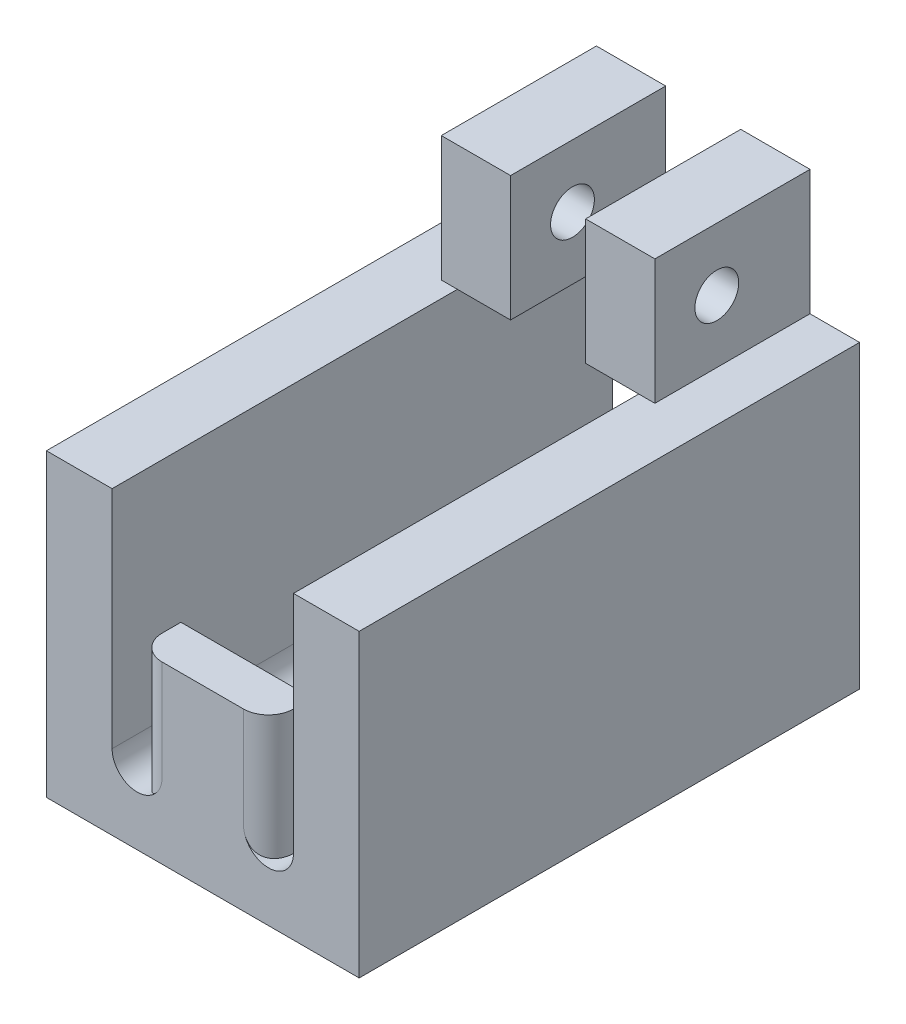
ISO-10303-21;
HEADER;
FILE_DESCRIPTION(('STEP AP214'),'2;1');
FILE_NAME('part.step','',(''),(''),'','','');
FILE_SCHEMA(('AUTOMOTIVE_DESIGN { 1 0 10303 214 1 1 1 1 }'));
ENDSEC;
DATA;
#1=APPLICATION_CONTEXT('core data for automotive mechanical design processes');
#2=APPLICATION_PROTOCOL_DEFINITION('international standard','automotive_design',2000,#1);
#3=PRODUCT_CONTEXT('',#1,'mechanical');
#4=PRODUCT('Part','Part','',(#3));
#5=PRODUCT_RELATED_PRODUCT_CATEGORY('part','',(#4));
#6=PRODUCT_DEFINITION_FORMATION('','',#4);
#7=PRODUCT_DEFINITION_CONTEXT('part definition',#1,'design');
#8=PRODUCT_DEFINITION('design','',#6,#7);
#9=PRODUCT_DEFINITION_SHAPE('','',#8);
#10=(LENGTH_UNIT() NAMED_UNIT(*) SI_UNIT(.MILLI.,.METRE.));
#11=(NAMED_UNIT(*) PLANE_ANGLE_UNIT() SI_UNIT($,.RADIAN.));
#12=(NAMED_UNIT(*) SI_UNIT($,.STERADIAN.) SOLID_ANGLE_UNIT());
#13=UNCERTAINTY_MEASURE_WITH_UNIT(LENGTH_MEASURE(1.E-05),#10,'distance_accuracy_value','');
#14=(GEOMETRIC_REPRESENTATION_CONTEXT(3) GLOBAL_UNCERTAINTY_ASSIGNED_CONTEXT((#13)) GLOBAL_UNIT_ASSIGNED_CONTEXT((#10,
#11,#12)) REPRESENTATION_CONTEXT('',''));
#15=CARTESIAN_POINT('',(0.,0.,0.));
#16=DIRECTION('',(0.,0.,1.));
#17=DIRECTION('',(1.,0.,0.));
#18=AXIS2_PLACEMENT_3D('',#15,#16,#17);
#19=CARTESIAN_POINT('',(0.,24.,0.));
#20=DIRECTION('',(0.,1.,0.));
#21=DIRECTION('',(0.,0.,1.));
#22=AXIS2_PLACEMENT_3D('',#19,#20,#21);
#23=PLANE('',#22);
#24=DIRECTION('',(0.,0.,-1.));
#25=VECTOR('',#24,1.);
#26=CARTESIAN_POINT('',(-7.25,24.,-20.));
#27=LINE('',#26,#25);
#28=CARTESIAN_POINT('',(-7.24999999999999,24.,20.));
#29=VERTEX_POINT('',#28);
#30=CARTESIAN_POINT('',(-7.24999999999999,24.,-7.60158133328304));
#31=VERTEX_POINT('',#30);
#32=EDGE_CURVE('E308',#29,#31,#27,.T.);
#33=ORIENTED_EDGE('',*,*,#32,.T.);
#34=DIRECTION('',(1.,0.,0.));
#35=VECTOR('',#34,1.);
#36=CARTESIAN_POINT('',(-8.5368304392369,24.,-7.60158133328304));
#37=LINE('',#36,#35);
#38=CARTESIAN_POINT('',(-8.5368304392369,24.,-7.60158133328304));
#39=VERTEX_POINT('',#38);
#40=EDGE_CURVE('E713',#39,#31,#37,.T.);
#41=ORIENTED_EDGE('',*,*,#40,.F.);
#42=DIRECTION('',(0.,0.,1.));
#43=VECTOR('',#42,1.);
#44=CARTESIAN_POINT('',(-8.5368304392369,24.,-20.));
#45=LINE('',#44,#43);
#46=CARTESIAN_POINT('',(-8.5368304392369,24.,-20.));
#47=VERTEX_POINT('',#46);
#48=EDGE_CURVE('E227',#47,#39,#45,.T.);
#49=ORIENTED_EDGE('',*,*,#48,.F.);
#50=DIRECTION('',(-1.,0.,0.));
#51=VECTOR('',#50,1.);
#52=CARTESIAN_POINT('',(-12.5,24.,-20.));
#53=LINE('',#52,#51);
#54=CARTESIAN_POINT('',(-12.5,24.,-20.));
#55=VERTEX_POINT('',#54);
#56=EDGE_CURVE('E311',#47,#55,#53,.T.);
#57=ORIENTED_EDGE('',*,*,#56,.T.);
#58=DIRECTION('',(0.,0.,1.));
#59=VECTOR('',#58,1.);
#60=CARTESIAN_POINT('',(-12.5,24.,-20.));
#61=LINE('',#60,#59);
#62=CARTESIAN_POINT('',(-12.5,24.,20.));
#63=VERTEX_POINT('',#62);
#64=EDGE_CURVE('E302',#55,#63,#61,.T.);
#65=ORIENTED_EDGE('',*,*,#64,.T.);
#66=DIRECTION('',(1.,0.,0.));
#67=VECTOR('',#66,1.);
#68=CARTESIAN_POINT('',(-12.5,24.,20.));
#69=LINE('',#68,#67);
#70=EDGE_CURVE('E305',#63,#29,#69,.T.);
#71=ORIENTED_EDGE('',*,*,#70,.T.);
#72=EDGE_LOOP('',(#33,#41,#49,#57,#65,#71));
#73=FACE_BOUND('',#72,.T.);
#74=ADVANCED_FACE('F39',(#73),#23,.T.);
#75=CARTESIAN_POINT('',(0.,24.,0.));
#76=DIRECTION('',(0.,1.,0.));
#77=DIRECTION('',(0.,0.,1.));
#78=AXIS2_PLACEMENT_3D('',#75,#76,#77);
#79=PLANE('',#78);
#80=DIRECTION('',(1.,0.,0.));
#81=VECTOR('',#80,1.);
#82=CARTESIAN_POINT('',(12.5,24.,-20.));
#83=LINE('',#82,#81);
#84=CARTESIAN_POINT('',(8.5368304392369,24.,-20.));
#85=VERTEX_POINT('',#84);
#86=CARTESIAN_POINT('',(12.5,24.,-20.));
#87=VERTEX_POINT('',#86);
#88=EDGE_CURVE('E287',#85,#87,#83,.T.);
#89=ORIENTED_EDGE('',*,*,#88,.F.);
#90=DIRECTION('',(0.,0.,-1.));
#91=VECTOR('',#90,1.);
#92=CARTESIAN_POINT('',(8.5368304392369,24.,-20.));
#93=LINE('',#92,#91);
#94=CARTESIAN_POINT('',(8.5368304392369,24.,-7.60158133328304));
#95=VERTEX_POINT('',#94);
#96=EDGE_CURVE('E259',#95,#85,#93,.T.);
#97=ORIENTED_EDGE('',*,*,#96,.F.);
#98=DIRECTION('',(-1.,0.,0.));
#99=VECTOR('',#98,1.);
#100=CARTESIAN_POINT('',(0.,24.,-7.60158133328304));
#101=LINE('',#100,#99);
#102=CARTESIAN_POINT('',(7.25,24.,-7.60158133328304));
#103=VERTEX_POINT('',#102);
#104=EDGE_CURVE('E11',#95,#103,#101,.T.);
#105=ORIENTED_EDGE('',*,*,#104,.T.);
#106=DIRECTION('',(0.,0.,-1.));
#107=VECTOR('',#106,1.);
#108=CARTESIAN_POINT('',(7.25,24.,-20.));
#109=LINE('',#108,#107);
#110=CARTESIAN_POINT('',(7.24999999999999,24.,20.));
#111=VERTEX_POINT('',#110);
#112=EDGE_CURVE('E290',#111,#103,#109,.T.);
#113=ORIENTED_EDGE('',*,*,#112,.F.);
#114=DIRECTION('',(-1.,0.,0.));
#115=VECTOR('',#114,1.);
#116=CARTESIAN_POINT('',(12.5,24.,20.));
#117=LINE('',#116,#115);
#118=CARTESIAN_POINT('',(12.5,24.,20.));
#119=VERTEX_POINT('',#118);
#120=EDGE_CURVE('E293',#119,#111,#117,.T.);
#121=ORIENTED_EDGE('',*,*,#120,.F.);
#122=DIRECTION('',(0.,0.,1.));
#123=VECTOR('',#122,1.);
#124=CARTESIAN_POINT('',(12.5,24.,-20.));
#125=LINE('',#124,#123);
#126=EDGE_CURVE('E284',#87,#119,#125,.T.);
#127=ORIENTED_EDGE('',*,*,#126,.F.);
#128=EDGE_LOOP('',(#89,#97,#105,#113,#121,#127));
#129=FACE_BOUND('',#128,.T.);
#130=ADVANCED_FACE('F415',(#129),#79,.T.);
#131=CARTESIAN_POINT('',(0.,4.,0.));
#132=DIRECTION('',(0.,1.,0.));
#133=DIRECTION('',(0.,0.,1.));
#134=AXIS2_PLACEMENT_3D('',#131,#132,#133);
#135=PLANE('',#134);
#136=DIRECTION('',(0.,0.,-1.));
#137=VECTOR('',#136,1.);
#138=CARTESIAN_POINT('',(-5.25,4.,0.));
#139=LINE('',#138,#137);
#140=CARTESIAN_POINT('',(-5.25,4.,-20.));
#141=VERTEX_POINT('',#140);
#142=CARTESIAN_POINT('',(-5.25,4.,14.5));
#143=VERTEX_POINT('',#142);
#144=EDGE_CURVE('E343',#141,#143,#139,.F.);
#145=ORIENTED_EDGE('',*,*,#144,.T.);
#146=DIRECTION('',(-1.,0.,0.));
#147=VECTOR('',#146,1.);
#148=CARTESIAN_POINT('',(0.,4.,14.5));
#149=LINE('',#148,#147);
#150=CARTESIAN_POINT('',(5.25,4.,14.5));
#151=VERTEX_POINT('',#150);
#152=EDGE_CURVE('E379',#143,#151,#149,.F.);
#153=ORIENTED_EDGE('',*,*,#152,.T.);
#154=DIRECTION('',(0.,0.,-1.));
#155=VECTOR('',#154,1.);
#156=CARTESIAN_POINT('',(5.25,4.,-20.));
#157=LINE('',#156,#155);
#158=CARTESIAN_POINT('',(5.25,4.,-20.));
#159=VERTEX_POINT('',#158);
#160=EDGE_CURVE('E346',#151,#159,#157,.T.);
#161=ORIENTED_EDGE('',*,*,#160,.T.);
#162=DIRECTION('',(-1.,0.,0.));
#163=VECTOR('',#162,1.);
#164=CARTESIAN_POINT('',(12.5,4.,-20.));
#165=LINE('',#164,#163);
#166=EDGE_CURVE('E320',#159,#141,#165,.T.);
#167=ORIENTED_EDGE('',*,*,#166,.T.);
#168=EDGE_LOOP('',(#145,#153,#161,#167));
#169=FACE_BOUND('',#168,.T.);
#170=ADVANCED_FACE('F421',(#169),#135,.T.);
#171=CARTESIAN_POINT('',(12.5,4.,20.));
#172=DIRECTION('',(-1.,0.,0.));
#173=DIRECTION('',(0.,0.,1.));
#174=AXIS2_PLACEMENT_3D('',#171,#172,#173);
#175=PLANE('',#174);
#176=DIRECTION('',(0.,0.,-1.));
#177=VECTOR('',#176,1.);
#178=CARTESIAN_POINT('',(12.5,0.,20.));
#179=LINE('',#178,#177);
#180=CARTESIAN_POINT('',(12.5,0.,20.));
#181=VERTEX_POINT('',#180);
#182=CARTESIAN_POINT('',(12.5,0.,-20.));
#183=VERTEX_POINT('',#182);
#184=EDGE_CURVE('E319',#181,#183,#179,.T.);
#185=ORIENTED_EDGE('',*,*,#184,.T.);
#186=DIRECTION('',(0.,-1.,0.));
#187=VECTOR('',#186,1.);
#188=CARTESIAN_POINT('',(12.5,4.,-20.));
#189=LINE('',#188,#187);
#190=EDGE_CURVE('E340',#87,#183,#189,.T.);
#191=ORIENTED_EDGE('',*,*,#190,.F.);
#192=ORIENTED_EDGE('',*,*,#126,.T.);
#193=DIRECTION('',(0.,-1.,0.));
#194=VECTOR('',#193,1.);
#195=CARTESIAN_POINT('',(12.5,4.,20.));
#196=LINE('',#195,#194);
#197=EDGE_CURVE('E323',#119,#181,#196,.T.);
#198=ORIENTED_EDGE('',*,*,#197,.T.);
#199=EDGE_LOOP('',(#185,#191,#192,#198));
#200=FACE_BOUND('',#199,.T.);
#201=ADVANCED_FACE('F434',(#200),#175,.F.);
#202=CARTESIAN_POINT('',(12.5,4.,-20.));
#203=DIRECTION('',(0.,0.,1.));
#204=DIRECTION('',(1.,0.,0.));
#205=AXIS2_PLACEMENT_3D('',#202,#203,#204);
#206=PLANE('',#205);
#207=DIRECTION('',(-1.,0.,0.));
#208=VECTOR('',#207,1.);
#209=CARTESIAN_POINT('',(12.5,0.,-20.));
#210=LINE('',#209,#208);
#211=CARTESIAN_POINT('',(-12.5,0.,-20.));
#212=VERTEX_POINT('',#211);
#213=EDGE_CURVE('E327',#183,#212,#210,.T.);
#214=ORIENTED_EDGE('',*,*,#213,.T.);
#215=DIRECTION('',(0.,-1.,0.));
#216=VECTOR('',#215,1.);
#217=CARTESIAN_POINT('',(-12.5,4.,-20.));
#218=LINE('',#217,#216);
#219=EDGE_CURVE('E338',#55,#212,#218,.T.);
#220=ORIENTED_EDGE('',*,*,#219,.F.);
#221=ORIENTED_EDGE('',*,*,#56,.F.);
#222=DIRECTION('',(0.,-1.,0.));
#223=VECTOR('',#222,1.);
#224=CARTESIAN_POINT('',(-8.5368304392369,34.,-20.));
#225=LINE('',#224,#223);
#226=CARTESIAN_POINT('',(-8.5368304392369,34.,-20.));
#227=VERTEX_POINT('',#226);
#228=EDGE_CURVE('E55',#227,#47,#225,.T.);
#229=ORIENTED_EDGE('',*,*,#228,.F.);
#230=DIRECTION('',(-1.,0.,0.));
#231=VECTOR('',#230,1.);
#232=CARTESIAN_POINT('',(-8.5368304392369,34.,-20.));
#233=LINE('',#232,#231);
#234=CARTESIAN_POINT('',(-3.,34.,-20.));
#235=VERTEX_POINT('',#234);
#236=EDGE_CURVE('E218',#235,#227,#233,.T.);
#237=ORIENTED_EDGE('',*,*,#236,.F.);
#238=DIRECTION('',(0.,-1.,0.));
#239=VECTOR('',#238,1.);
#240=CARTESIAN_POINT('',(-3.,34.,-20.));
#241=LINE('',#240,#239);
#242=CARTESIAN_POINT('',(-3.,24.,-20.));
#243=VERTEX_POINT('',#242);
#244=EDGE_CURVE('E215',#235,#243,#241,.T.);
#245=ORIENTED_EDGE('',*,*,#244,.T.);
#246=DIRECTION('',(-1.,0.,0.));
#247=VECTOR('',#246,1.);
#248=CARTESIAN_POINT('',(-8.5368304392369,24.,-20.));
#249=LINE('',#248,#247);
#250=CARTESIAN_POINT('',(-7.24999999999999,24.,-20.));
#251=VERTEX_POINT('',#250);
#252=EDGE_CURVE('E717',#243,#251,#249,.T.);
#253=ORIENTED_EDGE('',*,*,#252,.T.);
#254=DIRECTION('',(0.,-1.,0.));
#255=VECTOR('',#254,1.);
#256=CARTESIAN_POINT('',(-7.25,24.,-20.));
#257=LINE('',#256,#255);
#258=CARTESIAN_POINT('',(-7.25,6.,-20.));
#259=VERTEX_POINT('',#258);
#260=EDGE_CURVE('E313',#251,#259,#257,.T.);
#261=ORIENTED_EDGE('',*,*,#260,.T.);
#262=CARTESIAN_POINT('',(-5.25,6.,-20.));
#263=DIRECTION('',(0.,0.,1.));
#264=DIRECTION('',(1.,0.,0.));
#265=AXIS2_PLACEMENT_3D('',#262,#263,#264);
#266=CIRCLE('',#265,2.);
#267=EDGE_CURVE('E358',#259,#141,#266,.T.);
#268=ORIENTED_EDGE('',*,*,#267,.T.);
#269=ORIENTED_EDGE('',*,*,#166,.F.);
#270=CARTESIAN_POINT('',(5.25,6.,-20.));
#271=DIRECTION('',(0.,0.,1.));
#272=DIRECTION('',(1.,0.,0.));
#273=AXIS2_PLACEMENT_3D('',#270,#271,#272);
#274=CIRCLE('',#273,2.);
#275=CARTESIAN_POINT('',(7.25,6.,-20.));
#276=VERTEX_POINT('',#275);
#277=EDGE_CURVE('E354',#159,#276,#274,.T.);
#278=ORIENTED_EDGE('',*,*,#277,.T.);
#279=DIRECTION('',(0.,-1.,0.));
#280=VECTOR('',#279,1.);
#281=CARTESIAN_POINT('',(7.25,24.,-20.));
#282=LINE('',#281,#280);
#283=CARTESIAN_POINT('',(7.24999999999999,24.,-20.));
#284=VERTEX_POINT('',#283);
#285=EDGE_CURVE('E299',#284,#276,#282,.T.);
#286=ORIENTED_EDGE('',*,*,#285,.F.);
#287=DIRECTION('',(-1.,0.,0.));
#288=VECTOR('',#287,1.);
#289=CARTESIAN_POINT('',(8.5368304392369,24.,-20.));
#290=LINE('',#289,#288);
#291=CARTESIAN_POINT('',(3.,24.,-20.));
#292=VERTEX_POINT('',#291);
#293=EDGE_CURVE('E257',#284,#292,#290,.T.);
#294=ORIENTED_EDGE('',*,*,#293,.T.);
#295=DIRECTION('',(0.,-1.,0.));
#296=VECTOR('',#295,1.);
#297=CARTESIAN_POINT('',(3.,34.,-20.));
#298=LINE('',#297,#296);
#299=CARTESIAN_POINT('',(3.,34.,-20.));
#300=VERTEX_POINT('',#299);
#301=EDGE_CURVE('E243',#300,#292,#298,.T.);
#302=ORIENTED_EDGE('',*,*,#301,.F.);
#303=DIRECTION('',(-1.,0.,0.));
#304=VECTOR('',#303,1.);
#305=CARTESIAN_POINT('',(8.5368304392369,34.,-20.));
#306=LINE('',#305,#304);
#307=CARTESIAN_POINT('',(8.5368304392369,34.,-20.));
#308=VERTEX_POINT('',#307);
#309=EDGE_CURVE('E265',#308,#300,#306,.T.);
#310=ORIENTED_EDGE('',*,*,#309,.F.);
#311=DIRECTION('',(0.,-1.,0.));
#312=VECTOR('',#311,1.);
#313=CARTESIAN_POINT('',(8.5368304392369,34.,-20.));
#314=LINE('',#313,#312);
#315=EDGE_CURVE('E241',#308,#85,#314,.T.);
#316=ORIENTED_EDGE('',*,*,#315,.T.);
#317=ORIENTED_EDGE('',*,*,#88,.T.);
#318=ORIENTED_EDGE('',*,*,#190,.T.);
#319=EDGE_LOOP('',(#214,#220,#221,#229,#237,#245,#253,#261,#268,#269,#278,#286,#294,#302,#310,
#316,#317,#318));
#320=FACE_BOUND('',#319,.T.);
#321=ADVANCED_FACE('F446',(#320),#206,.F.);
#322=CARTESIAN_POINT('',(-12.5,4.,20.));
#323=DIRECTION('',(-1.,0.,0.));
#324=DIRECTION('',(0.,0.,1.));
#325=AXIS2_PLACEMENT_3D('',#322,#323,#324);
#326=PLANE('',#325);
#327=DIRECTION('',(0.,0.,-1.));
#328=VECTOR('',#327,1.);
#329=CARTESIAN_POINT('',(-12.5,0.,20.));
#330=LINE('',#329,#328);
#331=CARTESIAN_POINT('',(-12.5,0.,20.));
#332=VERTEX_POINT('',#331);
#333=EDGE_CURVE('E330',#332,#212,#330,.T.);
#334=ORIENTED_EDGE('',*,*,#333,.F.);
#335=DIRECTION('',(0.,-1.,0.));
#336=VECTOR('',#335,1.);
#337=CARTESIAN_POINT('',(-12.5,4.,20.));
#338=LINE('',#337,#336);
#339=EDGE_CURVE('E336',#63,#332,#338,.T.);
#340=ORIENTED_EDGE('',*,*,#339,.F.);
#341=ORIENTED_EDGE('',*,*,#64,.F.);
#342=ORIENTED_EDGE('',*,*,#219,.T.);
#343=EDGE_LOOP('',(#334,#340,#341,#342));
#344=FACE_BOUND('',#343,.T.);
#345=ADVANCED_FACE('F442',(#344),#326,.T.);
#346=CARTESIAN_POINT('',(12.5,4.,20.));
#347=DIRECTION('',(0.,0.,1.));
#348=DIRECTION('',(1.,0.,0.));
#349=AXIS2_PLACEMENT_3D('',#346,#347,#348);
#350=PLANE('',#349);
#351=DIRECTION('',(1.,0.,0.));
#352=VECTOR('',#351,1.);
#353=CARTESIAN_POINT('',(-5.24999999999999,14.,20.));
#354=LINE('',#353,#352);
#355=CARTESIAN_POINT('',(-3.24999999999999,14.,20.));
#356=VERTEX_POINT('',#355);
#357=CARTESIAN_POINT('',(3.24999999999999,14.,20.));
#358=VERTEX_POINT('',#357);
#359=EDGE_CURVE('E271',#356,#358,#354,.T.);
#360=ORIENTED_EDGE('',*,*,#359,.F.);
#361=DIRECTION('',(0.,-1.,0.));
#362=VECTOR('',#361,1.);
#363=CARTESIAN_POINT('',(-3.24999999999999,4.,20.));
#364=LINE('',#363,#362);
#365=CARTESIAN_POINT('',(-3.24999999999999,6.,20.));
#366=VERTEX_POINT('',#365);
#367=EDGE_CURVE('E364',#356,#366,#364,.T.);
#368=ORIENTED_EDGE('',*,*,#367,.T.);
#369=CARTESIAN_POINT('',(-5.24999999999999,6.,20.));
#370=DIRECTION('',(0.,0.,1.));
#371=DIRECTION('',(1.,0.,0.));
#372=AXIS2_PLACEMENT_3D('',#369,#370,#371);
#373=CIRCLE('',#372,2.);
#374=CARTESIAN_POINT('',(-7.24999999999999,6.,20.));
#375=VERTEX_POINT('',#374);
#376=EDGE_CURVE('E360',#366,#375,#373,.F.);
#377=ORIENTED_EDGE('',*,*,#376,.T.);
#378=DIRECTION('',(0.,-1.,0.));
#379=VECTOR('',#378,1.);
#380=CARTESIAN_POINT('',(-7.24999999999999,24.,20.));
#381=LINE('',#380,#379);
#382=EDGE_CURVE('E316',#29,#375,#381,.T.);
#383=ORIENTED_EDGE('',*,*,#382,.F.);
#384=ORIENTED_EDGE('',*,*,#70,.F.);
#385=ORIENTED_EDGE('',*,*,#339,.T.);
#386=DIRECTION('',(-1.,0.,0.));
#387=VECTOR('',#386,1.);
#388=CARTESIAN_POINT('',(12.5,0.,20.));
#389=LINE('',#388,#387);
#390=EDGE_CURVE('E324',#181,#332,#389,.T.);
#391=ORIENTED_EDGE('',*,*,#390,.F.);
#392=ORIENTED_EDGE('',*,*,#197,.F.);
#393=ORIENTED_EDGE('',*,*,#120,.T.);
#394=DIRECTION('',(0.,-1.,0.));
#395=VECTOR('',#394,1.);
#396=CARTESIAN_POINT('',(7.24999999999999,24.,20.));
#397=LINE('',#396,#395);
#398=CARTESIAN_POINT('',(7.24999999999999,6.,20.));
#399=VERTEX_POINT('',#398);
#400=EDGE_CURVE('E296',#111,#399,#397,.T.);
#401=ORIENTED_EDGE('',*,*,#400,.T.);
#402=CARTESIAN_POINT('',(5.24999999999999,6.,20.));
#403=DIRECTION('',(0.,0.,1.));
#404=DIRECTION('',(1.,0.,0.));
#405=AXIS2_PLACEMENT_3D('',#402,#403,#404);
#406=CIRCLE('',#405,2.);
#407=CARTESIAN_POINT('',(3.24999999999999,6.,20.));
#408=VERTEX_POINT('',#407);
#409=EDGE_CURVE('E356',#399,#408,#406,.F.);
#410=ORIENTED_EDGE('',*,*,#409,.T.);
#411=DIRECTION('',(0.,-1.,0.));
#412=VECTOR('',#411,1.);
#413=CARTESIAN_POINT('',(3.24999999999999,14.,20.));
#414=LINE('',#413,#412);
#415=EDGE_CURVE('E362',#408,#358,#414,.F.);
#416=ORIENTED_EDGE('',*,*,#415,.T.);
#417=EDGE_LOOP('',(#360,#368,#377,#383,#384,#385,#391,#392,#393,#401,#410,#416));
#418=FACE_BOUND('',#417,.T.);
#419=ADVANCED_FACE('F438',(#418),#350,.T.);
#420=CARTESIAN_POINT('',(0.,0.,0.));
#421=DIRECTION('',(0.,1.,0.));
#422=DIRECTION('',(0.,0.,1.));
#423=AXIS2_PLACEMENT_3D('',#420,#421,#422);
#424=PLANE('',#423);
#425=ORIENTED_EDGE('',*,*,#184,.F.);
#426=ORIENTED_EDGE('',*,*,#390,.T.);
#427=ORIENTED_EDGE('',*,*,#333,.T.);
#428=ORIENTED_EDGE('',*,*,#213,.F.);
#429=EDGE_LOOP('',(#425,#426,#427,#428));
#430=FACE_BOUND('',#429,.T.);
#431=ADVANCED_FACE('F430',(#430),#424,.F.);
#432=CARTESIAN_POINT('',(-7.25,24.,-20.));
#433=DIRECTION('',(-1.,0.,0.));
#434=DIRECTION('',(0.,0.,1.));
#435=AXIS2_PLACEMENT_3D('',#432,#433,#434);
#436=PLANE('',#435);
#437=ORIENTED_EDGE('',*,*,#382,.T.);
#438=DIRECTION('',(0.,0.,-1.));
#439=VECTOR('',#438,1.);
#440=CARTESIAN_POINT('',(-7.25,6.,-20.));
#441=LINE('',#440,#439);
#442=EDGE_CURVE('E351',#375,#259,#441,.T.);
#443=ORIENTED_EDGE('',*,*,#442,.T.);
#444=ORIENTED_EDGE('',*,*,#260,.F.);
#445=EDGE_CURVE('E307',#31,#251,#27,.T.);
#446=ORIENTED_EDGE('',*,*,#445,.F.);
#447=ORIENTED_EDGE('',*,*,#32,.F.);
#448=EDGE_LOOP('',(#437,#443,#444,#446,#447));
#449=FACE_BOUND('',#448,.T.);
#450=ADVANCED_FACE('F427',(#449),#436,.F.);
#451=CARTESIAN_POINT('',(7.25,24.,-20.));
#452=DIRECTION('',(-1.,0.,0.));
#453=DIRECTION('',(0.,0.,1.));
#454=AXIS2_PLACEMENT_3D('',#451,#452,#453);
#455=PLANE('',#454);
#456=ORIENTED_EDGE('',*,*,#285,.T.);
#457=DIRECTION('',(0.,0.,-1.));
#458=VECTOR('',#457,1.);
#459=CARTESIAN_POINT('',(7.24999999999999,6.,20.));
#460=LINE('',#459,#458);
#461=EDGE_CURVE('E349',#276,#399,#460,.F.);
#462=ORIENTED_EDGE('',*,*,#461,.T.);
#463=ORIENTED_EDGE('',*,*,#400,.F.);
#464=ORIENTED_EDGE('',*,*,#112,.T.);
#465=EDGE_CURVE('E289',#103,#284,#109,.T.);
#466=ORIENTED_EDGE('',*,*,#465,.T.);
#467=EDGE_LOOP('',(#456,#462,#463,#464,#466));
#468=FACE_BOUND('',#467,.T.);
#469=ADVANCED_FACE('F426',(#468),#455,.T.);
#470=CARTESIAN_POINT('',(5.25,6.,0.));
#471=DIRECTION('',(0.,0.,1.));
#472=DIRECTION('',(1.,0.,0.));
#473=AXIS2_PLACEMENT_3D('',#470,#471,#472);
#474=CYLINDRICAL_SURFACE('',#473,2.);
#475=ORIENTED_EDGE('',*,*,#409,.F.);
#476=ORIENTED_EDGE('',*,*,#461,.F.);
#477=ORIENTED_EDGE('',*,*,#277,.F.);
#478=ORIENTED_EDGE('',*,*,#160,.F.);
#479=CARTESIAN_POINT('',(5.24999999999999,4.,18.));
#480=VERTEX_POINT('',#479);
#481=EDGE_CURVE('E348',#480,#151,#157,.T.);
#482=ORIENTED_EDGE('',*,*,#481,.F.);
#483=CARTESIAN_POINT('',(5.24999999999999,4.,18.));
#484=CARTESIAN_POINT('',(5.25000522617415,4.00001691729757,18.0556762803909));
#485=CARTESIAN_POINT('',(5.24767515688469,4.00000041670275,18.1113501135902));
#486=CARTESIAN_POINT('',(5.23838443437571,4.00002387445264,18.2223097955765));
#487=CARTESIAN_POINT('',(5.23142380934807,4.00006383245363,18.2775956467234));
#488=CARTESIAN_POINT('',(5.21289570254966,4.00032372766829,18.3874935187263));
#489=CARTESIAN_POINT('',(5.20132013996978,4.00054398129801,18.442104183467));
#490=CARTESIAN_POINT('',(5.17365462187525,4.001410409819,18.5501511238877));
#491=CARTESIAN_POINT('',(5.15756472477129,4.00205657919952,18.6035874147532));
#492=CARTESIAN_POINT('',(5.10264193394559,4.00509188923848,18.7616744624877));
#493=CARTESIAN_POINT('',(5.05715929609031,4.00857799184413,18.8640836097391));
#494=CARTESIAN_POINT('',(4.94993067467701,4.02190821476302,19.0595379746445));
#495=CARTESIAN_POINT('',(4.88819960173657,4.03174651785079,19.1525916698261));
#496=CARTESIAN_POINT('',(4.78681758360956,4.05408244502824,19.2810292601309));
#497=CARTESIAN_POINT('',(4.75232833136299,4.06255186911279,19.3212849202439));
#498=CARTESIAN_POINT('',(4.68066991737118,4.0823855809239,19.3985535456984));
#499=CARTESIAN_POINT('',(4.64350224309544,4.09374827061562,19.4355682859766));
#500=CARTESIAN_POINT('',(4.5670543109652,4.11978429820092,19.5060100609295));
#501=CARTESIAN_POINT('',(4.52777621415248,4.13445429687542,19.5394406644328));
#502=CARTESIAN_POINT('',(4.44775025265913,4.16744072274959,19.6024964307838));
#503=CARTESIAN_POINT('',(4.40700264478742,4.18575651532162,19.6321222544595));
#504=CARTESIAN_POINT('',(4.29485743982334,4.24104151623171,19.7074999570591));
#505=CARTESIAN_POINT('',(4.22267464857436,4.28190218173565,19.7493540888252));
#506=CARTESIAN_POINT('',(4.08025024248377,4.37551484008002,19.8212847671377));
#507=CARTESIAN_POINT('',(4.01000871222471,4.42826735014514,19.8513608012509));
#508=CARTESIAN_POINT('',(3.87911614614816,4.54132731691333,19.8996854660837));
#509=CARTESIAN_POINT('',(3.8181453179799,4.60102067105445,19.9185179682224));
#510=CARTESIAN_POINT('',(3.70360896591071,4.72876352150664,19.9487831828288));
#511=CARTESIAN_POINT('',(3.65004522711792,4.79681502469589,19.960214113954));
#512=CARTESIAN_POINT('',(3.54709970316478,4.94681121465208,19.9785692670693));
#513=CARTESIAN_POINT('',(3.49865502806773,5.02946429937192,19.9849361519208));
#514=CARTESIAN_POINT('',(3.41399746478453,5.20109006202454,19.9937216539002));
#515=CARTESIAN_POINT('',(3.37779479001239,5.29006794216715,19.9961369806868));
#516=CARTESIAN_POINT('',(3.33192839339224,5.4310009574871,19.9983853872024));
#517=CARTESIAN_POINT('',(3.31766708548359,5.4815001370364,19.9988922889142));
#518=CARTESIAN_POINT('',(3.2931509316388,5.58347927302419,19.9995723374061));
#519=CARTESIAN_POINT('',(3.28289644248712,5.6349593163752,19.9997454544699));
#520=CARTESIAN_POINT('',(3.26647120089378,5.73853930006974,19.9999498879982));
#521=CARTESIAN_POINT('',(3.26029852193051,5.79063893614254,19.9999812713986));
#522=CARTESIAN_POINT('',(3.25206098214908,5.89515846240585,19.9999996347006));
#523=CARTESIAN_POINT('',(3.24999585310254,5.9475783314605,19.9999866175018));
#524=CARTESIAN_POINT('',(3.24999999999999,6.,20.));
#525=B_SPLINE_CURVE_WITH_KNOTS('',3,(#483,#484,#485,#486,#487,#488,#489,#490,#491,#492,#493,
#494,#495,#496,#497,#498,#499,#500,#501,#502,#503,#504,#505,#506,#507,#508,#509,#510,#511,#512,
#513,#514,#515,#516,#517,#518,#519,#520,#521,#522,#523,#524),.UNSPECIFIED.,.F.,.F.,(4,2,2,2,2,2,
2,2,2,2,2,2,2,2,2,2,2,2,2,2,4),(0.,0.166975669456348,0.333950322335805,0.501218642994511,
0.668484799478483,1.00307655016576,1.33736232180719,1.49820683683045,1.65896270472556,
1.81955698688304,1.98012333861254,2.2572023372389,2.53429338948394,2.79534445721546,
3.05645832900396,3.3433892350094,3.63055893820404,3.78785058830356,3.94515624114185,
4.10238759619615,4.25960868349994),.UNSPECIFIED.);
#526=EDGE_CURVE('E390',#480,#408,#525,.T.);
#527=ORIENTED_EDGE('',*,*,#526,.T.);
#528=EDGE_LOOP('',(#475,#476,#477,#478,#482,#527));
#529=FACE_BOUND('',#528,.T.);
#530=ADVANCED_FACE('F453',(#529),#474,.F.);
#531=CARTESIAN_POINT('',(-5.25,6.,-20.));
#532=DIRECTION('',(0.,0.,-1.));
#533=DIRECTION('',(-1.,0.,0.));
#534=AXIS2_PLACEMENT_3D('',#531,#532,#533);
#535=CYLINDRICAL_SURFACE('',#534,2.);
#536=ORIENTED_EDGE('',*,*,#376,.F.);
#537=CARTESIAN_POINT('',(-3.24999999999999,6.,20.));
#538=CARTESIAN_POINT('',(-3.24999477382584,5.9443237196091,19.9999830827024));
#539=CARTESIAN_POINT('',(-3.2523248431153,5.88864988640976,19.9999995832973));
#540=CARTESIAN_POINT('',(-3.26161556562428,5.77769020442352,19.9999761255474));
#541=CARTESIAN_POINT('',(-3.26857619065192,5.72240435327656,19.9999361675464));
#542=CARTESIAN_POINT('',(-3.28710429745033,5.61250648127374,19.9996762723317));
#543=CARTESIAN_POINT('',(-3.2986798600302,5.55789581653295,19.999456018702));
#544=CARTESIAN_POINT('',(-3.32634537812474,5.44984887611225,19.998589590181));
#545=CARTESIAN_POINT('',(-3.3424352752287,5.39641258524684,19.9979434208005));
#546=CARTESIAN_POINT('',(-3.39735806605439,5.2383255375123,19.9949081107615));
#547=CARTESIAN_POINT('',(-3.44284070390968,5.13591639026087,19.9914220081559));
#548=CARTESIAN_POINT('',(-3.55006932532298,4.94046202535547,19.978091785237));
#549=CARTESIAN_POINT('',(-3.61180039826342,4.84740833017386,19.9682534821492));
#550=CARTESIAN_POINT('',(-3.71318241639043,4.71897073986911,19.9459175549718));
#551=CARTESIAN_POINT('',(-3.747671668637,4.67871507975611,19.9374481308872));
#552=CARTESIAN_POINT('',(-3.81933008262881,4.60144645430159,19.9176144190761));
#553=CARTESIAN_POINT('',(-3.85649775690455,4.56443171402343,19.9062517293844));
#554=CARTESIAN_POINT('',(-3.93294568903478,4.49398993907051,19.8802157017991));
#555=CARTESIAN_POINT('',(-3.9722237858475,4.46055933556724,19.8655457031246));
#556=CARTESIAN_POINT('',(-4.05224974734086,4.39750356921624,19.8325592772504));
#557=CARTESIAN_POINT('',(-4.09299735521257,4.36787774554054,19.8142434846784));
#558=CARTESIAN_POINT('',(-4.20514256017665,4.29250004294092,19.7589584837683));
#559=CARTESIAN_POINT('',(-4.27732535142563,4.25064591117476,19.7180978182643));
#560=CARTESIAN_POINT('',(-4.41974975751622,4.17871523286226,19.62448515992));
#561=CARTESIAN_POINT('',(-4.48999128777528,4.14863919874909,19.5717326498549));
#562=CARTESIAN_POINT('',(-4.62088385385183,4.10031453391626,19.4586726830867));
#563=CARTESIAN_POINT('',(-4.68185468202009,4.0814820317776,19.3989793289456));
#564=CARTESIAN_POINT('',(-4.79639103408928,4.05121681717121,19.2712364784934));
#565=CARTESIAN_POINT('',(-4.84995477288206,4.03978588604599,19.2031849753041));
#566=CARTESIAN_POINT('',(-4.9529002968352,4.02143073293069,19.0531887853479));
#567=CARTESIAN_POINT('',(-5.00134497193226,4.01506384807921,18.9705357006281));
#568=CARTESIAN_POINT('',(-5.08600253521546,4.00627834609985,18.7989099379755));
#569=CARTESIAN_POINT('',(-5.1222052099876,4.00386301931316,18.7099320578329));
#570=CARTESIAN_POINT('',(-5.16807160660775,4.00161461279765,18.5689990425129));
#571=CARTESIAN_POINT('',(-5.1823329145164,4.00110771108584,18.5184998629636));
#572=CARTESIAN_POINT('',(-5.20684906836119,4.00042766259395,18.4165207269758));
#573=CARTESIAN_POINT('',(-5.21710355751286,4.0002545455301,18.3650406836248));
#574=CARTESIAN_POINT('',(-5.23352879910621,4.00005011200177,18.2614606999303));
#575=CARTESIAN_POINT('',(-5.23970147806947,4.00001872860139,18.2093610638575));
#576=CARTESIAN_POINT('',(-5.2479390178509,4.00000036529941,18.1048415375941));
#577=CARTESIAN_POINT('',(-5.25000414689745,4.00001338249825,18.0524216685395));
#578=CARTESIAN_POINT('',(-5.24999999999999,4.,18.));
#579=B_SPLINE_CURVE_WITH_KNOTS('',3,(#537,#538,#539,#540,#541,#542,#543,#544,#545,#546,#547,
#548,#549,#550,#551,#552,#553,#554,#555,#556,#557,#558,#559,#560,#561,#562,#563,#564,#565,#566,
#567,#568,#569,#570,#571,#572,#573,#574,#575,#576,#577,#578),.UNSPECIFIED.,.F.,.F.,(4,2,2,2,2,2,
2,2,2,2,2,2,2,2,2,2,2,2,2,2,4),(0.,0.166975669456347,0.333950322335805,0.50121864299451,
0.668484799478482,1.00307655016576,1.33736232180719,1.49820683683045,1.65896270472556,
1.81955698688304,1.98012333861254,2.25720233723891,2.53429338948394,2.79534445721546,
3.05645832900396,3.3433892350094,3.63055893820404,3.78785058830356,3.94515624114185,
4.10238759619615,4.25960868349994),.UNSPECIFIED.);
#580=CARTESIAN_POINT('',(-5.24999999999999,4.,18.));
#581=VERTEX_POINT('',#580);
#582=EDGE_CURVE('E382',#366,#581,#579,.T.);
#583=ORIENTED_EDGE('',*,*,#582,.T.);
#584=DIRECTION('',(0.,0.,1.));
#585=VECTOR('',#584,1.);
#586=CARTESIAN_POINT('',(-5.24999999999999,4.,20.));
#587=LINE('',#586,#585);
#588=EDGE_CURVE('E233',#143,#581,#587,.T.);
#589=ORIENTED_EDGE('',*,*,#588,.F.);
#590=ORIENTED_EDGE('',*,*,#144,.F.);
#591=ORIENTED_EDGE('',*,*,#267,.F.);
#592=ORIENTED_EDGE('',*,*,#442,.F.);
#593=EDGE_LOOP('',(#536,#583,#589,#590,#591,#592));
#594=FACE_BOUND('',#593,.T.);
#595=ADVANCED_FACE('F397',(#594),#535,.F.);
#596=CARTESIAN_POINT('',(-5.24999999999999,14.,20.));
#597=DIRECTION('',(1.,0.,0.));
#598=DIRECTION('',(0.,0.,-1.));
#599=AXIS2_PLACEMENT_3D('',#596,#597,#598);
#600=PLANE('',#599);
#601=ORIENTED_EDGE('',*,*,#588,.T.);
#602=DIRECTION('',(0.,-1.,0.));
#603=VECTOR('',#602,1.);
#604=CARTESIAN_POINT('',(-5.24999999999999,14.,18.));
#605=LINE('',#604,#603);
#606=CARTESIAN_POINT('',(-5.24999999999999,14.,18.));
#607=VERTEX_POINT('',#606);
#608=EDGE_CURVE('E367',#581,#607,#605,.F.);
#609=ORIENTED_EDGE('',*,*,#608,.T.);
#610=DIRECTION('',(0.,0.,1.));
#611=VECTOR('',#610,1.);
#612=CARTESIAN_POINT('',(-5.24999999999999,14.,20.));
#613=LINE('',#612,#611);
#614=CARTESIAN_POINT('',(-5.24999999999999,14.,16.5));
#615=VERTEX_POINT('',#614);
#616=EDGE_CURVE('E236',#615,#607,#613,.T.);
#617=ORIENTED_EDGE('',*,*,#616,.F.);
#618=DIRECTION('',(0.,-1.,0.));
#619=VECTOR('',#618,1.);
#620=CARTESIAN_POINT('',(-5.24999999999999,14.,16.5));
#621=LINE('',#620,#619);
#622=CARTESIAN_POINT('',(-5.24999999999999,6.,16.5));
#623=VERTEX_POINT('',#622);
#624=EDGE_CURVE('E277',#615,#623,#621,.T.);
#625=ORIENTED_EDGE('',*,*,#624,.T.);
#626=CARTESIAN_POINT('',(-5.24999999999999,6.,14.5));
#627=DIRECTION('',(1.,0.,0.));
#628=DIRECTION('',(0.,0.,-1.));
#629=AXIS2_PLACEMENT_3D('',#626,#627,#628);
#630=CIRCLE('',#629,2.);
#631=EDGE_CURVE('E500',#623,#143,#630,.T.);
#632=ORIENTED_EDGE('',*,*,#631,.T.);
#633=EDGE_LOOP('',(#601,#609,#617,#625,#632));
#634=FACE_BOUND('',#633,.T.);
#635=ADVANCED_FACE('F460',(#634),#600,.F.);
#636=CARTESIAN_POINT('',(5.24999999999999,14.,20.));
#637=DIRECTION('',(-1.,0.,0.));
#638=DIRECTION('',(0.,0.,1.));
#639=AXIS2_PLACEMENT_3D('',#636,#637,#638);
#640=PLANE('',#639);
#641=DIRECTION('',(0.,0.,-1.));
#642=VECTOR('',#641,1.);
#643=CARTESIAN_POINT('',(5.24999999999999,14.,20.));
#644=LINE('',#643,#642);
#645=CARTESIAN_POINT('',(5.24999999999999,14.,18.));
#646=VERTEX_POINT('',#645);
#647=CARTESIAN_POINT('',(5.24999999999999,14.,16.5));
#648=VERTEX_POINT('',#647);
#649=EDGE_CURVE('E274',#646,#648,#644,.T.);
#650=ORIENTED_EDGE('',*,*,#649,.F.);
#651=DIRECTION('',(0.,-1.,0.));
#652=VECTOR('',#651,1.);
#653=CARTESIAN_POINT('',(5.24999999999999,4.,18.));
#654=LINE('',#653,#652);
#655=EDGE_CURVE('E373',#646,#480,#654,.T.);
#656=ORIENTED_EDGE('',*,*,#655,.T.);
#657=ORIENTED_EDGE('',*,*,#481,.T.);
#658=CARTESIAN_POINT('',(5.24999999999999,6.,14.5));
#659=DIRECTION('',(-1.,0.,0.));
#660=DIRECTION('',(0.,0.,1.));
#661=AXIS2_PLACEMENT_3D('',#658,#659,#660);
#662=CIRCLE('',#661,2.);
#663=CARTESIAN_POINT('',(5.24999999999999,6.,16.5));
#664=VERTEX_POINT('',#663);
#665=EDGE_CURVE('E48',#151,#664,#662,.T.);
#666=ORIENTED_EDGE('',*,*,#665,.T.);
#667=DIRECTION('',(0.,-1.,0.));
#668=VECTOR('',#667,1.);
#669=CARTESIAN_POINT('',(5.24999999999999,14.,16.5));
#670=LINE('',#669,#668);
#671=EDGE_CURVE('E281',#648,#664,#670,.T.);
#672=ORIENTED_EDGE('',*,*,#671,.F.);
#673=EDGE_LOOP('',(#650,#656,#657,#666,#672));
#674=FACE_BOUND('',#673,.T.);
#675=ADVANCED_FACE('F516',(#674),#640,.F.);
#676=CARTESIAN_POINT('',(-5.24999999999999,14.,16.5));
#677=DIRECTION('',(0.,0.,1.));
#678=DIRECTION('',(1.,0.,0.));
#679=AXIS2_PLACEMENT_3D('',#676,#677,#678);
#680=PLANE('',#679);
#681=ORIENTED_EDGE('',*,*,#671,.T.);
#682=DIRECTION('',(-1.,0.,0.));
#683=VECTOR('',#682,1.);
#684=CARTESIAN_POINT('',(-5.24999999999999,6.,16.5));
#685=LINE('',#684,#683);
#686=EDGE_CURVE('E376',#664,#623,#685,.T.);
#687=ORIENTED_EDGE('',*,*,#686,.T.);
#688=ORIENTED_EDGE('',*,*,#624,.F.);
#689=DIRECTION('',(-1.,0.,0.));
#690=VECTOR('',#689,1.);
#691=CARTESIAN_POINT('',(-5.24999999999999,14.,16.5));
#692=LINE('',#691,#690);
#693=EDGE_CURVE('E276',#648,#615,#692,.T.);
#694=ORIENTED_EDGE('',*,*,#693,.F.);
#695=EDGE_LOOP('',(#681,#687,#688,#694));
#696=FACE_BOUND('',#695,.T.);
#697=ADVANCED_FACE('F519',(#696),#680,.F.);
#698=CARTESIAN_POINT('',(0.,14.,0.));
#699=DIRECTION('',(0.,-1.,0.));
#700=DIRECTION('',(0.,0.,-1.));
#701=AXIS2_PLACEMENT_3D('',#698,#699,#700);
#702=PLANE('',#701);
#703=ORIENTED_EDGE('',*,*,#616,.T.);
#704=CARTESIAN_POINT('',(-3.24999999999999,14.,18.));
#705=DIRECTION('',(0.,-1.,0.));
#706=DIRECTION('',(0.,0.,-1.));
#707=AXIS2_PLACEMENT_3D('',#704,#705,#706);
#708=CIRCLE('',#707,2.);
#709=EDGE_CURVE('E371',#607,#356,#708,.F.);
#710=ORIENTED_EDGE('',*,*,#709,.T.);
#711=ORIENTED_EDGE('',*,*,#359,.T.);
#712=CARTESIAN_POINT('',(3.24999999999999,14.,18.));
#713=DIRECTION('',(0.,-1.,0.));
#714=DIRECTION('',(0.,0.,-1.));
#715=AXIS2_PLACEMENT_3D('',#712,#713,#714);
#716=CIRCLE('',#715,2.);
#717=EDGE_CURVE('E369',#358,#646,#716,.F.);
#718=ORIENTED_EDGE('',*,*,#717,.T.);
#719=ORIENTED_EDGE('',*,*,#649,.T.);
#720=ORIENTED_EDGE('',*,*,#693,.T.);
#721=EDGE_LOOP('',(#703,#710,#711,#718,#719,#720));
#722=FACE_BOUND('',#721,.T.);
#723=ADVANCED_FACE('F403',(#722),#702,.F.);
#724=CARTESIAN_POINT('',(-3.24999999999999,4.,18.));
#725=DIRECTION('',(0.,1.,0.));
#726=DIRECTION('',(0.,0.,1.));
#727=AXIS2_PLACEMENT_3D('',#724,#725,#726);
#728=CYLINDRICAL_SURFACE('',#727,2.);
#729=ORIENTED_EDGE('',*,*,#709,.F.);
#730=ORIENTED_EDGE('',*,*,#608,.F.);
#731=ORIENTED_EDGE('',*,*,#582,.F.);
#732=ORIENTED_EDGE('',*,*,#367,.F.);
#733=EDGE_LOOP('',(#729,#730,#731,#732));
#734=FACE_BOUND('',#733,.T.);
#735=ADVANCED_FACE('F399',(#734),#728,.T.);
#736=CARTESIAN_POINT('',(3.24999999999999,14.,18.));
#737=DIRECTION('',(0.,1.,0.));
#738=DIRECTION('',(0.,0.,1.));
#739=AXIS2_PLACEMENT_3D('',#736,#737,#738);
#740=CYLINDRICAL_SURFACE('',#739,2.);
#741=ORIENTED_EDGE('',*,*,#717,.F.);
#742=ORIENTED_EDGE('',*,*,#415,.F.);
#743=ORIENTED_EDGE('',*,*,#526,.F.);
#744=ORIENTED_EDGE('',*,*,#655,.F.);
#745=EDGE_LOOP('',(#741,#742,#743,#744));
#746=FACE_BOUND('',#745,.T.);
#747=ADVANCED_FACE('F402',(#746),#740,.T.);
#748=CARTESIAN_POINT('',(-5.24999999999999,6.,14.5));
#749=DIRECTION('',(-1.,0.,0.));
#750=DIRECTION('',(0.,0.,1.));
#751=AXIS2_PLACEMENT_3D('',#748,#749,#750);
#752=CYLINDRICAL_SURFACE('',#751,2.);
#753=ORIENTED_EDGE('',*,*,#665,.F.);
#754=ORIENTED_EDGE('',*,*,#152,.F.);
#755=ORIENTED_EDGE('',*,*,#631,.F.);
#756=ORIENTED_EDGE('',*,*,#686,.F.);
#757=EDGE_LOOP('',(#753,#754,#755,#756));
#758=FACE_BOUND('',#757,.T.);
#759=ADVANCED_FACE('F41',(#758),#752,.F.);
#760=CARTESIAN_POINT('',(8.5368304392369,34.,-20.));
#761=DIRECTION('',(-1.,0.,0.));
#762=DIRECTION('',(0.,0.,1.));
#763=AXIS2_PLACEMENT_3D('',#760,#761,#762);
#764=PLANE('',#763);
#765=CARTESIAN_POINT('',(8.5368304392369,29.,-12.5507906666415));
#766=DIRECTION('',(-1.,0.,0.));
#767=DIRECTION('',(0.,0.,1.));
#768=AXIS2_PLACEMENT_3D('',#765,#766,#767);
#769=CIRCLE('',#768,1.75);
#770=CARTESIAN_POINT('',(8.5368304392369,29.,-10.8007906666415));
#771=VERTEX_POINT('',#770);
#772=EDGE_CURVE('E244',#771,#771,#769,.T.);
#773=ORIENTED_EDGE('',*,*,#772,.T.);
#774=EDGE_LOOP('',(#773));
#775=FACE_BOUND('',#774,.T.);
#776=ORIENTED_EDGE('',*,*,#96,.T.);
#777=ORIENTED_EDGE('',*,*,#315,.F.);
#778=DIRECTION('',(0.,0.,-1.));
#779=VECTOR('',#778,1.);
#780=CARTESIAN_POINT('',(8.5368304392369,34.,-20.));
#781=LINE('',#780,#779);
#782=CARTESIAN_POINT('',(8.5368304392369,34.,-7.60158133328304));
#783=VERTEX_POINT('',#782);
#784=EDGE_CURVE('E255',#783,#308,#781,.T.);
#785=ORIENTED_EDGE('',*,*,#784,.F.);
#786=DIRECTION('',(0.,-1.,0.));
#787=VECTOR('',#786,1.);
#788=CARTESIAN_POINT('',(8.5368304392369,34.,-7.60158133328304));
#789=LINE('',#788,#787);
#790=EDGE_CURVE('E249',#783,#95,#789,.T.);
#791=ORIENTED_EDGE('',*,*,#790,.T.);
#792=EDGE_LOOP('',(#776,#777,#785,#791));
#793=FACE_BOUND('',#792,.T.);
#794=ADVANCED_FACE('F411',(#775,#793),#764,.F.);
#795=CARTESIAN_POINT('',(3.,34.,-20.));
#796=DIRECTION('',(1.,0.,0.));
#797=DIRECTION('',(0.,0.,-1.));
#798=AXIS2_PLACEMENT_3D('',#795,#796,#797);
#799=PLANE('',#798);
#800=CARTESIAN_POINT('',(3.,29.,-12.5507906666415));
#801=DIRECTION('',(1.,0.,0.));
#802=DIRECTION('',(0.,0.,-1.));
#803=AXIS2_PLACEMENT_3D('',#800,#801,#802);
#804=CIRCLE('',#803,1.75);
#805=CARTESIAN_POINT('',(3.,29.,-14.3007906666415));
#806=VERTEX_POINT('',#805);
#807=EDGE_CURVE('E702',#806,#806,#804,.T.);
#808=ORIENTED_EDGE('',*,*,#807,.T.);
#809=EDGE_LOOP('',(#808));
#810=FACE_BOUND('',#809,.T.);
#811=DIRECTION('',(0.,0.,1.));
#812=VECTOR('',#811,1.);
#813=CARTESIAN_POINT('',(3.,24.,-20.));
#814=LINE('',#813,#812);
#815=CARTESIAN_POINT('',(2.99999999999999,24.,-7.60158133328304));
#816=VERTEX_POINT('',#815);
#817=EDGE_CURVE('E254',#292,#816,#814,.T.);
#818=ORIENTED_EDGE('',*,*,#817,.T.);
#819=DIRECTION('',(0.,-1.,0.));
#820=VECTOR('',#819,1.);
#821=CARTESIAN_POINT('',(2.99999999999999,34.,-7.60158133328304));
#822=LINE('',#821,#820);
#823=CARTESIAN_POINT('',(2.99999999999999,34.,-7.60158133328304));
#824=VERTEX_POINT('',#823);
#825=EDGE_CURVE('E247',#824,#816,#822,.T.);
#826=ORIENTED_EDGE('',*,*,#825,.F.);
#827=DIRECTION('',(0.,0.,1.));
#828=VECTOR('',#827,1.);
#829=CARTESIAN_POINT('',(3.,34.,-20.));
#830=LINE('',#829,#828);
#831=EDGE_CURVE('E263',#300,#824,#830,.T.);
#832=ORIENTED_EDGE('',*,*,#831,.F.);
#833=ORIENTED_EDGE('',*,*,#301,.T.);
#834=EDGE_LOOP('',(#818,#826,#832,#833));
#835=FACE_BOUND('',#834,.T.);
#836=ADVANCED_FACE('F599',(#810,#835),#799,.F.);
#837=CARTESIAN_POINT('',(8.5368304392369,34.,-7.60158133328304));
#838=DIRECTION('',(0.,0.,-1.));
#839=DIRECTION('',(-1.,0.,0.));
#840=AXIS2_PLACEMENT_3D('',#837,#838,#839);
#841=PLANE('',#840);
#842=DIRECTION('',(1.,0.,0.));
#843=VECTOR('',#842,1.);
#844=CARTESIAN_POINT('',(8.5368304392369,24.,-7.60158133328304));
#845=LINE('',#844,#843);
#846=EDGE_CURVE('E63',#816,#103,#845,.T.);
#847=ORIENTED_EDGE('',*,*,#846,.T.);
#848=ORIENTED_EDGE('',*,*,#104,.F.);
#849=ORIENTED_EDGE('',*,*,#790,.F.);
#850=DIRECTION('',(1.,0.,0.));
#851=VECTOR('',#850,1.);
#852=CARTESIAN_POINT('',(8.5368304392369,34.,-7.60158133328304));
#853=LINE('',#852,#851);
#854=EDGE_CURVE('E252',#824,#783,#853,.T.);
#855=ORIENTED_EDGE('',*,*,#854,.F.);
#856=ORIENTED_EDGE('',*,*,#825,.T.);
#857=EDGE_LOOP('',(#847,#848,#849,#855,#856));
#858=FACE_BOUND('',#857,.T.);
#859=ADVANCED_FACE('F478',(#858),#841,.F.);
#860=CARTESIAN_POINT('',(0.,34.,0.));
#861=DIRECTION('',(0.,-1.,0.));
#862=DIRECTION('',(0.,0.,-1.));
#863=AXIS2_PLACEMENT_3D('',#860,#861,#862);
#864=PLANE('',#863);
#865=ORIENTED_EDGE('',*,*,#784,.T.);
#866=ORIENTED_EDGE('',*,*,#309,.T.);
#867=ORIENTED_EDGE('',*,*,#831,.T.);
#868=ORIENTED_EDGE('',*,*,#854,.T.);
#869=EDGE_LOOP('',(#865,#866,#867,#868));
#870=FACE_BOUND('',#869,.T.);
#871=ADVANCED_FACE('F484',(#870),#864,.F.);
#872=CARTESIAN_POINT('',(0.,24.,0.));
#873=DIRECTION('',(0.,-1.,0.));
#874=DIRECTION('',(0.,0.,-1.));
#875=AXIS2_PLACEMENT_3D('',#872,#873,#874);
#876=PLANE('',#875);
#877=ORIENTED_EDGE('',*,*,#293,.F.);
#878=ORIENTED_EDGE('',*,*,#465,.F.);
#879=ORIENTED_EDGE('',*,*,#846,.F.);
#880=ORIENTED_EDGE('',*,*,#817,.F.);
#881=EDGE_LOOP('',(#877,#878,#879,#880));
#882=FACE_BOUND('',#881,.T.);
#883=ADVANCED_FACE('F491',(#882),#876,.T.);
#884=CARTESIAN_POINT('',(0.,24.,0.));
#885=DIRECTION('',(0.,-1.,0.));
#886=DIRECTION('',(0.,0.,-1.));
#887=AXIS2_PLACEMENT_3D('',#884,#885,#886);
#888=PLANE('',#887);
#889=ORIENTED_EDGE('',*,*,#445,.T.);
#890=ORIENTED_EDGE('',*,*,#252,.F.);
#891=DIRECTION('',(0.,0.,-1.));
#892=VECTOR('',#891,1.);
#893=CARTESIAN_POINT('',(-3.,24.,-20.));
#894=LINE('',#893,#892);
#895=CARTESIAN_POINT('',(-2.99999999999999,24.,-7.60158133328304));
#896=VERTEX_POINT('',#895);
#897=EDGE_CURVE('E715',#896,#243,#894,.T.);
#898=ORIENTED_EDGE('',*,*,#897,.F.);
#899=EDGE_CURVE('E231',#31,#896,#37,.T.);
#900=ORIENTED_EDGE('',*,*,#899,.F.);
#901=EDGE_LOOP('',(#889,#890,#898,#900));
#902=FACE_BOUND('',#901,.T.);
#903=ADVANCED_FACE('F635',(#902),#888,.T.);
#904=CARTESIAN_POINT('',(-8.5368304392369,34.,-7.60158133328304));
#905=DIRECTION('',(0.,0.,-1.));
#906=DIRECTION('',(-1.,0.,0.));
#907=AXIS2_PLACEMENT_3D('',#904,#905,#906);
#908=PLANE('',#907);
#909=ORIENTED_EDGE('',*,*,#40,.T.);
#910=ORIENTED_EDGE('',*,*,#899,.T.);
#911=DIRECTION('',(0.,-1.,0.));
#912=VECTOR('',#911,1.);
#913=CARTESIAN_POINT('',(-2.99999999999999,34.,-7.60158133328304));
#914=LINE('',#913,#912);
#915=CARTESIAN_POINT('',(-2.99999999999999,34.,-7.60158133328304));
#916=VERTEX_POINT('',#915);
#917=EDGE_CURVE('E213',#916,#896,#914,.T.);
#918=ORIENTED_EDGE('',*,*,#917,.F.);
#919=DIRECTION('',(1.,0.,0.));
#920=VECTOR('',#919,1.);
#921=CARTESIAN_POINT('',(-8.5368304392369,34.,-7.60158133328304));
#922=LINE('',#921,#920);
#923=CARTESIAN_POINT('',(-8.5368304392369,34.,-7.60158133328304));
#924=VERTEX_POINT('',#923);
#925=EDGE_CURVE('E219',#924,#916,#922,.T.);
#926=ORIENTED_EDGE('',*,*,#925,.F.);
#927=DIRECTION('',(0.,-1.,0.));
#928=VECTOR('',#927,1.);
#929=CARTESIAN_POINT('',(-8.5368304392369,34.,-7.60158133328304));
#930=LINE('',#929,#928);
#931=EDGE_CURVE('E712',#924,#39,#930,.T.);
#932=ORIENTED_EDGE('',*,*,#931,.T.);
#933=EDGE_LOOP('',(#909,#910,#918,#926,#932));
#934=FACE_BOUND('',#933,.T.);
#935=ADVANCED_FACE('F230',(#934),#908,.F.);
#936=CARTESIAN_POINT('',(-3.,34.,-20.));
#937=DIRECTION('',(-1.,0.,0.));
#938=DIRECTION('',(0.,0.,1.));
#939=AXIS2_PLACEMENT_3D('',#936,#937,#938);
#940=PLANE('',#939);
#941=CARTESIAN_POINT('',(-3.,29.,-12.5507906666415));
#942=DIRECTION('',(-1.,0.,0.));
#943=DIRECTION('',(0.,0.,1.));
#944=AXIS2_PLACEMENT_3D('',#941,#942,#943);
#945=CIRCLE('',#944,1.75);
#946=CARTESIAN_POINT('',(-3.,29.,-10.8007906666415));
#947=VERTEX_POINT('',#946);
#948=EDGE_CURVE('E706',#947,#947,#945,.T.);
#949=ORIENTED_EDGE('',*,*,#948,.T.);
#950=EDGE_LOOP('',(#949));
#951=FACE_BOUND('',#950,.T.);
#952=ORIENTED_EDGE('',*,*,#897,.T.);
#953=ORIENTED_EDGE('',*,*,#244,.F.);
#954=DIRECTION('',(0.,0.,-1.));
#955=VECTOR('',#954,1.);
#956=CARTESIAN_POINT('',(-3.,34.,-20.));
#957=LINE('',#956,#955);
#958=EDGE_CURVE('E209',#916,#235,#957,.T.);
#959=ORIENTED_EDGE('',*,*,#958,.F.);
#960=ORIENTED_EDGE('',*,*,#917,.T.);
#961=EDGE_LOOP('',(#952,#953,#959,#960));
#962=FACE_BOUND('',#961,.T.);
#963=ADVANCED_FACE('F211',(#951,#962),#940,.F.);
#964=CARTESIAN_POINT('',(-8.5368304392369,34.,-20.));
#965=DIRECTION('',(1.,0.,0.));
#966=DIRECTION('',(0.,0.,-1.));
#967=AXIS2_PLACEMENT_3D('',#964,#965,#966);
#968=PLANE('',#967);
#969=CARTESIAN_POINT('',(-8.5368304392369,29.,-12.5507906666415));
#970=DIRECTION('',(1.,0.,0.));
#971=DIRECTION('',(0.,0.,-1.));
#972=AXIS2_PLACEMENT_3D('',#969,#970,#971);
#973=CIRCLE('',#972,1.75);
#974=CARTESIAN_POINT('',(-8.5368304392369,29.,-14.3007906666415));
#975=VERTEX_POINT('',#974);
#976=EDGE_CURVE('E43',#975,#975,#973,.T.);
#977=ORIENTED_EDGE('',*,*,#976,.T.);
#978=EDGE_LOOP('',(#977));
#979=FACE_BOUND('',#978,.T.);
#980=ORIENTED_EDGE('',*,*,#48,.T.);
#981=ORIENTED_EDGE('',*,*,#931,.F.);
#982=DIRECTION('',(0.,0.,1.));
#983=VECTOR('',#982,1.);
#984=CARTESIAN_POINT('',(-8.5368304392369,34.,-20.));
#985=LINE('',#984,#983);
#986=EDGE_CURVE('E223',#227,#924,#985,.T.);
#987=ORIENTED_EDGE('',*,*,#986,.F.);
#988=ORIENTED_EDGE('',*,*,#228,.T.);
#989=EDGE_LOOP('',(#980,#981,#987,#988));
#990=FACE_BOUND('',#989,.T.);
#991=ADVANCED_FACE('F660',(#979,#990),#968,.F.);
#992=CARTESIAN_POINT('',(0.,34.,0.));
#993=DIRECTION('',(0.,-1.,0.));
#994=DIRECTION('',(0.,0.,-1.));
#995=AXIS2_PLACEMENT_3D('',#992,#993,#994);
#996=PLANE('',#995);
#997=ORIENTED_EDGE('',*,*,#925,.T.);
#998=ORIENTED_EDGE('',*,*,#958,.T.);
#999=ORIENTED_EDGE('',*,*,#236,.T.);
#1000=ORIENTED_EDGE('',*,*,#986,.T.);
#1001=EDGE_LOOP('',(#997,#998,#999,#1000));
#1002=FACE_BOUND('',#1001,.T.);
#1003=ADVANCED_FACE('F222',(#1002),#996,.F.);
#1004=CARTESIAN_POINT('',(-12.5,29.,-12.5507906666415));
#1005=DIRECTION('',(1.,0.,0.));
#1006=DIRECTION('',(0.,0.,-1.));
#1007=AXIS2_PLACEMENT_3D('',#1004,#1005,#1006);
#1008=CYLINDRICAL_SURFACE('',#1007,1.75);
#1009=ORIENTED_EDGE('',*,*,#976,.F.);
#1010=EDGE_LOOP('',(#1009));
#1011=FACE_BOUND('',#1010,.T.);
#1012=ORIENTED_EDGE('',*,*,#948,.F.);
#1013=EDGE_LOOP('',(#1012));
#1014=FACE_BOUND('',#1013,.T.);
#1015=ADVANCED_FACE('F679',(#1011,#1014),#1008,.F.);
#1016=ORIENTED_EDGE('',*,*,#807,.F.);
#1017=EDGE_LOOP('',(#1016));
#1018=FACE_BOUND('',#1017,.T.);
#1019=ORIENTED_EDGE('',*,*,#772,.F.);
#1020=EDGE_LOOP('',(#1019));
#1021=FACE_BOUND('',#1020,.T.);
#1022=ADVANCED_FACE('F687',(#1018,#1021),#1008,.F.);
#1023=CLOSED_SHELL('',(#74,#130,#170,#201,#321,#345,#419,#431,#450,#469,#530,#595,#635,#675,
#697,#723,#735,#747,#759,#794,#836,#859,#871,#883,#903,#935,#963,#991,#1003,#1015,#1022));
#1024=MANIFOLD_SOLID_BREP('B2',#1023);
#1025=ADVANCED_BREP_SHAPE_REPRESENTATION('',(#18,#1024),#14);
#1026=SHAPE_DEFINITION_REPRESENTATION(#9,#1025);
ENDSEC;
END-ISO-10303-21;
